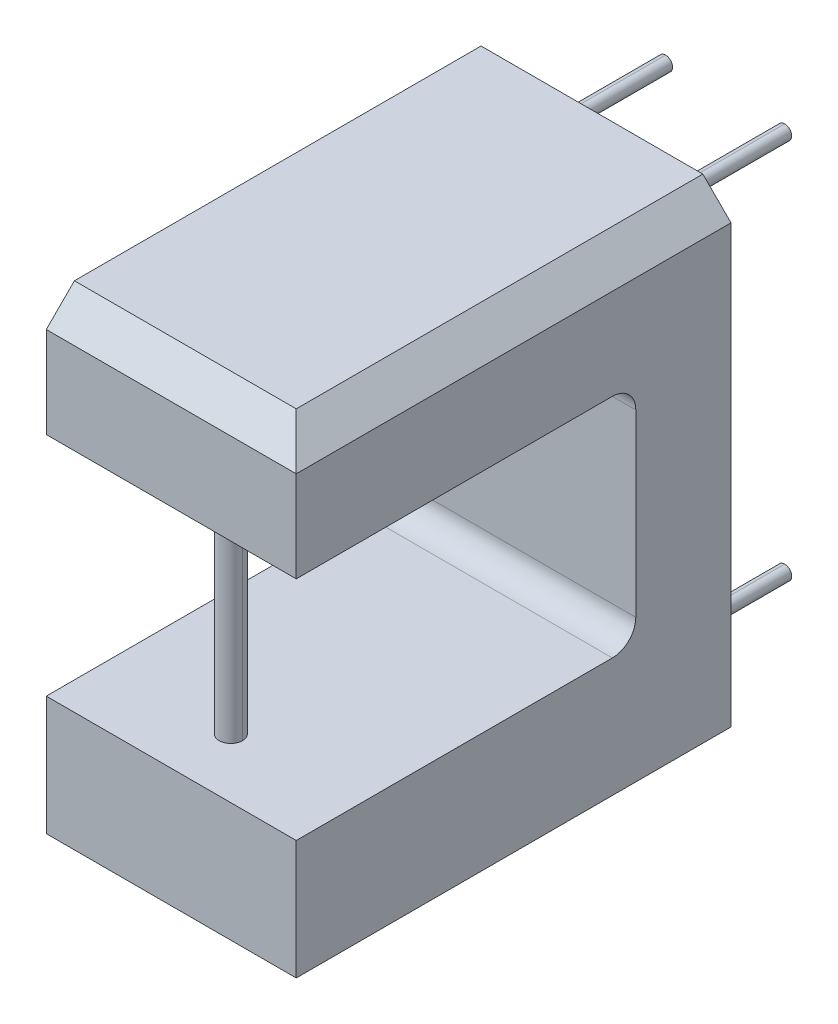
ISO-10303-21;
HEADER;
FILE_DESCRIPTION(('STEP AP214'),'2;1');
FILE_NAME('part.step','',(''),(''),'','','');
FILE_SCHEMA(('AUTOMOTIVE_DESIGN { 1 0 10303 214 1 1 1 1 }'));
ENDSEC;
DATA;
#1=APPLICATION_CONTEXT('core data for automotive mechanical design processes');
#2=APPLICATION_PROTOCOL_DEFINITION('international standard','automotive_design',2000,#1);
#3=PRODUCT_CONTEXT('',#1,'mechanical');
#4=PRODUCT('Part','Part','',(#3));
#5=PRODUCT_RELATED_PRODUCT_CATEGORY('part','',(#4));
#6=PRODUCT_DEFINITION_FORMATION('','',#4);
#7=PRODUCT_DEFINITION_CONTEXT('part definition',#1,'design');
#8=PRODUCT_DEFINITION('design','',#6,#7);
#9=PRODUCT_DEFINITION_SHAPE('','',#8);
#10=(LENGTH_UNIT() NAMED_UNIT(*) SI_UNIT(.MILLI.,.METRE.));
#11=(NAMED_UNIT(*) PLANE_ANGLE_UNIT() SI_UNIT($,.RADIAN.));
#12=(NAMED_UNIT(*) SI_UNIT($,.STERADIAN.) SOLID_ANGLE_UNIT());
#13=UNCERTAINTY_MEASURE_WITH_UNIT(LENGTH_MEASURE(1.E-05),#10,'distance_accuracy_value','');
#14=(GEOMETRIC_REPRESENTATION_CONTEXT(3) GLOBAL_UNCERTAINTY_ASSIGNED_CONTEXT((#13)) GLOBAL_UNIT_ASSIGNED_CONTEXT((#10,
#11,#12)) REPRESENTATION_CONTEXT('',''));
#15=CARTESIAN_POINT('',(0.,0.,0.));
#16=DIRECTION('',(0.,0.,1.));
#17=DIRECTION('',(1.,0.,0.));
#18=AXIS2_PLACEMENT_3D('',#15,#16,#17);
#19=CARTESIAN_POINT('',(-72.,-177.4,53.7));
#20=DIRECTION('',(0.,0.,-1.));
#21=DIRECTION('',(0.,-1.,0.));
#22=AXIS2_PLACEMENT_3D('',#19,#20,#21);
#23=PLANE('',#22);
#24=DIRECTION('',(-1.,0.,0.));
#25=VECTOR('',#24,1.);
#26=CARTESIAN_POINT('',(-72.,-177.4,53.7));
#27=LINE('',#26,#25);
#28=CARTESIAN_POINT('',(-72.6,-177.4,53.7));
#29=VERTEX_POINT('',#28);
#30=CARTESIAN_POINT('',(-77.33,-177.4,53.7));
#31=VERTEX_POINT('',#30);
#32=EDGE_CURVE('E228',#29,#31,#27,.T.);
#33=ORIENTED_EDGE('',*,*,#32,.F.);
#34=DIRECTION('',(0.707106781186539,-0.707106781186556,0.));
#35=VECTOR('',#34,1.);
#36=CARTESIAN_POINT('',(-72.3,-177.7,53.7));
#37=LINE('',#36,#35);
#38=CARTESIAN_POINT('',(-72.,-178.,53.7));
#39=VERTEX_POINT('',#38);
#40=EDGE_CURVE('E385',#29,#39,#37,.T.);
#41=ORIENTED_EDGE('',*,*,#40,.T.);
#42=DIRECTION('',(0.,-1.,0.));
#43=VECTOR('',#42,1.);
#44=CARTESIAN_POINT('',(-72.,-177.4,53.7));
#45=LINE('',#44,#43);
#46=CARTESIAN_POINT('',(-72.,-187.31,53.7));
#47=VERTEX_POINT('',#46);
#48=EDGE_CURVE('E338',#39,#47,#45,.T.);
#49=ORIENTED_EDGE('',*,*,#48,.T.);
#50=DIRECTION('',(-1.,0.,0.));
#51=VECTOR('',#50,1.);
#52=CARTESIAN_POINT('',(-72.,-187.31,53.7));
#53=LINE('',#52,#51);
#54=CARTESIAN_POINT('',(-77.33,-187.31,53.7));
#55=VERTEX_POINT('',#54);
#56=EDGE_CURVE('E253',#47,#55,#53,.T.);
#57=ORIENTED_EDGE('',*,*,#56,.T.);
#58=DIRECTION('',(0.,-1.,0.));
#59=VECTOR('',#58,1.);
#60=CARTESIAN_POINT('',(-77.33,-177.4,53.7));
#61=LINE('',#60,#59);
#62=EDGE_CURVE('E245',#31,#55,#61,.T.);
#63=ORIENTED_EDGE('',*,*,#62,.F.);
#64=EDGE_LOOP('',(#33,#41,#49,#57,#63));
#65=FACE_BOUND('',#64,.T.);
#66=CARTESIAN_POINT('',(-75.935,-178.29,53.7));
#67=DIRECTION('',(0.,0.,-1.));
#68=DIRECTION('',(0.,1.,0.));
#69=AXIS2_PLACEMENT_3D('',#66,#67,#68);
#70=CIRCLE('',#69,0.150000000000011);
#71=CARTESIAN_POINT('',(-75.935,-178.14,53.7));
#72=VERTEX_POINT('',#71);
#73=CARTESIAN_POINT('',(-75.935,-178.44,53.7));
#74=VERTEX_POINT('',#73);
#75=EDGE_CURVE('E287',#72,#74,#70,.T.);
#76=ORIENTED_EDGE('',*,*,#75,.F.);
#77=CARTESIAN_POINT('',(-75.935,-178.29,53.7));
#78=DIRECTION('',(0.,0.,-1.));
#79=DIRECTION('',(0.,-1.,0.));
#80=AXIS2_PLACEMENT_3D('',#77,#78,#79);
#81=CIRCLE('',#80,0.150000000000011);
#82=EDGE_CURVE('E286',#74,#72,#81,.T.);
#83=ORIENTED_EDGE('',*,*,#82,.F.);
#84=EDGE_LOOP('',(#76,#83));
#85=FACE_BOUND('',#84,.T.);
#86=CARTESIAN_POINT('',(-75.935,-186.42,53.7));
#87=DIRECTION('',(0.,0.,-1.));
#88=DIRECTION('',(0.,1.,0.));
#89=AXIS2_PLACEMENT_3D('',#86,#87,#88);
#90=CIRCLE('',#89,0.150000000000011);
#91=CARTESIAN_POINT('',(-75.935,-186.27,53.7));
#92=VERTEX_POINT('',#91);
#93=CARTESIAN_POINT('',(-75.935,-186.57,53.7));
#94=VERTEX_POINT('',#93);
#95=EDGE_CURVE('E445',#92,#94,#90,.T.);
#96=ORIENTED_EDGE('',*,*,#95,.F.);
#97=CARTESIAN_POINT('',(-75.935,-186.42,53.7));
#98=DIRECTION('',(0.,0.,-1.));
#99=DIRECTION('',(0.,-1.,0.));
#100=AXIS2_PLACEMENT_3D('',#97,#98,#99);
#101=CIRCLE('',#100,0.150000000000011);
#102=EDGE_CURVE('E343',#94,#92,#101,.T.);
#103=ORIENTED_EDGE('',*,*,#102,.F.);
#104=EDGE_LOOP('',(#96,#103));
#105=FACE_BOUND('',#104,.T.);
#106=CARTESIAN_POINT('',(-73.395,-178.29,53.7));
#107=DIRECTION('',(0.,0.,-1.));
#108=DIRECTION('',(0.,1.,0.));
#109=AXIS2_PLACEMENT_3D('',#106,#107,#108);
#110=CIRCLE('',#109,0.150000000000011);
#111=CARTESIAN_POINT('',(-73.395,-178.14,53.7));
#112=VERTEX_POINT('',#111);
#113=CARTESIAN_POINT('',(-73.395,-178.44,53.7));
#114=VERTEX_POINT('',#113);
#115=EDGE_CURVE('E303',#112,#114,#110,.T.);
#116=ORIENTED_EDGE('',*,*,#115,.F.);
#117=CARTESIAN_POINT('',(-73.395,-178.29,53.7));
#118=DIRECTION('',(0.,0.,-1.));
#119=DIRECTION('',(0.,-1.,0.));
#120=AXIS2_PLACEMENT_3D('',#117,#118,#119);
#121=CIRCLE('',#120,0.150000000000011);
#122=EDGE_CURVE('E277',#114,#112,#121,.T.);
#123=ORIENTED_EDGE('',*,*,#122,.F.);
#124=EDGE_LOOP('',(#116,#123));
#125=FACE_BOUND('',#124,.T.);
#126=CARTESIAN_POINT('',(-73.395,-186.42,53.7));
#127=DIRECTION('',(0.,0.,-1.));
#128=DIRECTION('',(0.,1.,0.));
#129=AXIS2_PLACEMENT_3D('',#126,#127,#128);
#130=CIRCLE('',#129,0.150000000000011);
#131=CARTESIAN_POINT('',(-73.395,-186.27,53.7));
#132=VERTEX_POINT('',#131);
#133=CARTESIAN_POINT('',(-73.395,-186.57,53.7));
#134=VERTEX_POINT('',#133);
#135=EDGE_CURVE('E292',#132,#134,#130,.T.);
#136=ORIENTED_EDGE('',*,*,#135,.F.);
#137=CARTESIAN_POINT('',(-73.395,-186.42,53.7));
#138=DIRECTION('',(0.,0.,-1.));
#139=DIRECTION('',(0.,-1.,0.));
#140=AXIS2_PLACEMENT_3D('',#137,#138,#139);
#141=CIRCLE('',#140,0.150000000000011);
#142=EDGE_CURVE('E450',#134,#132,#141,.T.);
#143=ORIENTED_EDGE('',*,*,#142,.F.);
#144=EDGE_LOOP('',(#136,#143));
#145=FACE_BOUND('',#144,.T.);
#146=ADVANCED_FACE('F51',(#65,#85,#105,#125,#145),#23,.T.);
#147=CARTESIAN_POINT('',(-72.,-182.355,53.7));
#148=DIRECTION('',(-1.,0.,0.));
#149=DIRECTION('',(0.,0.,1.));
#150=AXIS2_PLACEMENT_3D('',#147,#148,#149);
#151=PLANE('',#150);
#152=ORIENTED_EDGE('',*,*,#48,.F.);
#153=DIRECTION('',(0.,0.,1.));
#154=VECTOR('',#153,1.);
#155=CARTESIAN_POINT('',(-72.,-178.,62.97));
#156=LINE('',#155,#154);
#157=CARTESIAN_POINT('',(-72.,-178.,62.97));
#158=VERTEX_POINT('',#157);
#159=EDGE_CURVE('E388',#39,#158,#156,.T.);
#160=ORIENTED_EDGE('',*,*,#159,.T.);
#161=DIRECTION('',(0.,1.,0.));
#162=VECTOR('',#161,1.);
#163=CARTESIAN_POINT('',(-72.,-179.94,62.97));
#164=LINE('',#163,#162);
#165=CARTESIAN_POINT('',(-72.,-179.94,62.97));
#166=VERTEX_POINT('',#165);
#167=EDGE_CURVE('E239',#166,#158,#164,.T.);
#168=ORIENTED_EDGE('',*,*,#167,.F.);
#169=DIRECTION('',(0.,0.,1.));
#170=VECTOR('',#169,1.);
#171=CARTESIAN_POINT('',(-72.,-179.94,55.73));
#172=LINE('',#171,#170);
#173=CARTESIAN_POINT('',(-72.,-179.94,56.23));
#174=VERTEX_POINT('',#173);
#175=EDGE_CURVE('E364',#174,#166,#172,.T.);
#176=ORIENTED_EDGE('',*,*,#175,.F.);
#177=CARTESIAN_POINT('',(-72.,-180.44,56.23));
#178=DIRECTION('',(-1.,0.,0.));
#179=DIRECTION('',(0.,0.,1.));
#180=AXIS2_PLACEMENT_3D('',#177,#178,#179);
#181=CIRCLE('',#180,0.5);
#182=CARTESIAN_POINT('',(-72.,-180.44,55.73));
#183=VERTEX_POINT('',#182);
#184=EDGE_CURVE('E11',#174,#183,#181,.T.);
#185=ORIENTED_EDGE('',*,*,#184,.T.);
#186=DIRECTION('',(0.,1.,0.));
#187=VECTOR('',#186,1.);
#188=CARTESIAN_POINT('',(-72.,-184.77,55.73));
#189=LINE('',#188,#187);
#190=CARTESIAN_POINT('',(-72.,-184.27,55.73));
#191=VERTEX_POINT('',#190);
#192=EDGE_CURVE('E291',#191,#183,#189,.T.);
#193=ORIENTED_EDGE('',*,*,#192,.F.);
#194=CARTESIAN_POINT('',(-72.,-184.27,56.23));
#195=DIRECTION('',(-1.,0.,0.));
#196=DIRECTION('',(0.,0.,1.));
#197=AXIS2_PLACEMENT_3D('',#194,#195,#196);
#198=CIRCLE('',#197,0.5);
#199=CARTESIAN_POINT('',(-72.,-184.77,56.23));
#200=VERTEX_POINT('',#199);
#201=EDGE_CURVE('E410',#191,#200,#198,.T.);
#202=ORIENTED_EDGE('',*,*,#201,.T.);
#203=DIRECTION('',(0.,0.,-1.));
#204=VECTOR('',#203,1.);
#205=CARTESIAN_POINT('',(-72.,-184.77,62.97));
#206=LINE('',#205,#204);
#207=CARTESIAN_POINT('',(-72.,-184.77,62.97));
#208=VERTEX_POINT('',#207);
#209=EDGE_CURVE('E314',#208,#200,#206,.T.);
#210=ORIENTED_EDGE('',*,*,#209,.F.);
#211=DIRECTION('',(0.,1.,0.));
#212=VECTOR('',#211,1.);
#213=CARTESIAN_POINT('',(-72.,-187.31,62.97));
#214=LINE('',#213,#212);
#215=CARTESIAN_POINT('',(-72.,-187.31,62.97));
#216=VERTEX_POINT('',#215);
#217=EDGE_CURVE('E268',#216,#208,#214,.T.);
#218=ORIENTED_EDGE('',*,*,#217,.F.);
#219=DIRECTION('',(0.,0.,1.));
#220=VECTOR('',#219,1.);
#221=CARTESIAN_POINT('',(-72.,-187.31,53.7));
#222=LINE('',#221,#220);
#223=EDGE_CURVE('E326',#47,#216,#222,.T.);
#224=ORIENTED_EDGE('',*,*,#223,.F.);
#225=EDGE_LOOP('',(#152,#160,#168,#176,#185,#193,#202,#210,#218,#224));
#226=FACE_BOUND('',#225,.T.);
#227=ADVANCED_FACE('F624',(#226),#151,.F.);
#228=CARTESIAN_POINT('',(-75.935,-178.29,53.7));
#229=DIRECTION('',(0.,0.,-1.));
#230=DIRECTION('',(0.,-1.,0.));
#231=AXIS2_PLACEMENT_3D('',#228,#229,#230);
#232=CYLINDRICAL_SURFACE('',#231,0.150000000000011);
#233=DIRECTION('',(0.,0.,-1.));
#234=VECTOR('',#233,1.);
#235=CARTESIAN_POINT('',(-75.935,-178.14,53.7));
#236=LINE('',#235,#234);
#237=CARTESIAN_POINT('',(-75.935,-178.14,51.16));
#238=VERTEX_POINT('',#237);
#239=EDGE_CURVE('E334',#72,#238,#236,.T.);
#240=ORIENTED_EDGE('',*,*,#239,.T.);
#241=CARTESIAN_POINT('',(-75.935,-178.29,51.16));
#242=DIRECTION('',(0.,0.,-1.));
#243=DIRECTION('',(0.,-1.,0.));
#244=AXIS2_PLACEMENT_3D('',#241,#242,#243);
#245=CIRCLE('',#244,0.150000000000011);
#246=CARTESIAN_POINT('',(-75.935,-178.44,51.16));
#247=VERTEX_POINT('',#246);
#248=EDGE_CURVE('E308',#247,#238,#245,.T.);
#249=ORIENTED_EDGE('',*,*,#248,.F.);
#250=DIRECTION('',(0.,0.,-1.));
#251=VECTOR('',#250,1.);
#252=CARTESIAN_POINT('',(-75.935,-178.44,53.7));
#253=LINE('',#252,#251);
#254=EDGE_CURVE('E282',#74,#247,#253,.T.);
#255=ORIENTED_EDGE('',*,*,#254,.F.);
#256=ORIENTED_EDGE('',*,*,#82,.T.);
#257=EDGE_LOOP('',(#240,#249,#255,#256));
#258=FACE_BOUND('',#257,.T.);
#259=ADVANCED_FACE('F656',(#258),#232,.T.);
#260=CARTESIAN_POINT('',(-75.935,-178.29,53.7));
#261=DIRECTION('',(0.,0.,-1.));
#262=DIRECTION('',(0.,-1.,0.));
#263=AXIS2_PLACEMENT_3D('',#260,#261,#262);
#264=CYLINDRICAL_SURFACE('',#263,0.150000000000011);
#265=ORIENTED_EDGE('',*,*,#254,.T.);
#266=CARTESIAN_POINT('',(-75.935,-178.29,51.16));
#267=DIRECTION('',(0.,0.,-1.));
#268=DIRECTION('',(0.,1.,0.));
#269=AXIS2_PLACEMENT_3D('',#266,#267,#268);
#270=CIRCLE('',#269,0.150000000000011);
#271=EDGE_CURVE('E304',#238,#247,#270,.T.);
#272=ORIENTED_EDGE('',*,*,#271,.F.);
#273=ORIENTED_EDGE('',*,*,#239,.F.);
#274=ORIENTED_EDGE('',*,*,#75,.T.);
#275=EDGE_LOOP('',(#265,#272,#273,#274));
#276=FACE_BOUND('',#275,.T.);
#277=ADVANCED_FACE('F660',(#276),#264,.T.);
#278=CARTESIAN_POINT('',(-72.,-179.94,62.97));
#279=DIRECTION('',(0.,0.,1.));
#280=DIRECTION('',(1.,0.,0.));
#281=AXIS2_PLACEMENT_3D('',#278,#279,#280);
#282=PLANE('',#281);
#283=ORIENTED_EDGE('',*,*,#167,.T.);
#284=DIRECTION('',(-1.,0.,0.));
#285=VECTOR('',#284,1.);
#286=CARTESIAN_POINT('',(-72.,-178.,62.97));
#287=LINE('',#286,#285);
#288=CARTESIAN_POINT('',(-77.33,-178.,62.97));
#289=VERTEX_POINT('',#288);
#290=EDGE_CURVE('E354',#158,#289,#287,.T.);
#291=ORIENTED_EDGE('',*,*,#290,.T.);
#292=DIRECTION('',(0.,1.,0.));
#293=VECTOR('',#292,1.);
#294=CARTESIAN_POINT('',(-77.33,-179.94,62.97));
#295=LINE('',#294,#293);
#296=CARTESIAN_POINT('',(-77.33,-179.94,62.97));
#297=VERTEX_POINT('',#296);
#298=EDGE_CURVE('E249',#297,#289,#295,.T.);
#299=ORIENTED_EDGE('',*,*,#298,.F.);
#300=DIRECTION('',(-1.,0.,0.));
#301=VECTOR('',#300,1.);
#302=CARTESIAN_POINT('',(-72.,-179.94,62.97));
#303=LINE('',#302,#301);
#304=EDGE_CURVE('E367',#166,#297,#303,.T.);
#305=ORIENTED_EDGE('',*,*,#304,.F.);
#306=EDGE_LOOP('',(#283,#291,#299,#305));
#307=FACE_BOUND('',#306,.T.);
#308=ADVANCED_FACE('F589',(#307),#282,.T.);
#309=CARTESIAN_POINT('',(-72.,-177.4,62.97));
#310=DIRECTION('',(0.,1.,0.));
#311=DIRECTION('',(1.,0.,0.));
#312=AXIS2_PLACEMENT_3D('',#309,#310,#311);
#313=PLANE('',#312);
#314=DIRECTION('',(0.,0.,-1.));
#315=VECTOR('',#314,1.);
#316=CARTESIAN_POINT('',(-77.33,-177.4,62.97));
#317=LINE('',#316,#315);
#318=CARTESIAN_POINT('',(-77.33,-177.4,62.37));
#319=VERTEX_POINT('',#318);
#320=EDGE_CURVE('E231',#319,#31,#317,.T.);
#321=ORIENTED_EDGE('',*,*,#320,.F.);
#322=DIRECTION('',(1.,0.,0.));
#323=VECTOR('',#322,1.);
#324=CARTESIAN_POINT('',(-72.,-177.4,62.37));
#325=LINE('',#324,#323);
#326=CARTESIAN_POINT('',(-72.6,-177.4,62.37));
#327=VERTEX_POINT('',#326);
#328=EDGE_CURVE('E382',#319,#327,#325,.T.);
#329=ORIENTED_EDGE('',*,*,#328,.T.);
#330=DIRECTION('',(0.,0.,-1.));
#331=VECTOR('',#330,1.);
#332=CARTESIAN_POINT('',(-72.6,-177.4,53.7));
#333=LINE('',#332,#331);
#334=EDGE_CURVE('E234',#327,#29,#333,.T.);
#335=ORIENTED_EDGE('',*,*,#334,.T.);
#336=ORIENTED_EDGE('',*,*,#32,.T.);
#337=EDGE_LOOP('',(#321,#329,#335,#336));
#338=FACE_BOUND('',#337,.T.);
#339=ADVANCED_FACE('F230',(#338),#313,.T.);
#340=CARTESIAN_POINT('',(-72.,-182.355,51.16));
#341=DIRECTION('',(0.,0.,-1.));
#342=DIRECTION('',(0.,-1.,0.));
#343=AXIS2_PLACEMENT_3D('',#340,#341,#342);
#344=PLANE('',#343);
#345=CARTESIAN_POINT('',(-73.395,-186.42,51.16));
#346=DIRECTION('',(0.,0.,-1.));
#347=DIRECTION('',(0.,1.,0.));
#348=AXIS2_PLACEMENT_3D('',#345,#346,#347);
#349=CIRCLE('',#348,0.150000000000011);
#350=CARTESIAN_POINT('',(-73.395,-186.27,51.16));
#351=VERTEX_POINT('',#350);
#352=CARTESIAN_POINT('',(-73.395,-186.57,51.16));
#353=VERTEX_POINT('',#352);
#354=EDGE_CURVE('E240',#351,#353,#349,.T.);
#355=ORIENTED_EDGE('',*,*,#354,.T.);
#356=CARTESIAN_POINT('',(-73.395,-186.42,51.16));
#357=DIRECTION('',(0.,0.,-1.));
#358=DIRECTION('',(0.,-1.,0.));
#359=AXIS2_PLACEMENT_3D('',#356,#357,#358);
#360=CIRCLE('',#359,0.150000000000011);
#361=EDGE_CURVE('E278',#353,#351,#360,.T.);
#362=ORIENTED_EDGE('',*,*,#361,.T.);
#363=EDGE_LOOP('',(#355,#362));
#364=FACE_BOUND('',#363,.T.);
#365=ADVANCED_FACE('F588',(#364),#344,.T.);
#366=CARTESIAN_POINT('',(-73.395,-178.29,53.7));
#367=DIRECTION('',(0.,0.,-1.));
#368=DIRECTION('',(0.,-1.,0.));
#369=AXIS2_PLACEMENT_3D('',#366,#367,#368);
#370=CYLINDRICAL_SURFACE('',#369,0.150000000000011);
#371=DIRECTION('',(0.,0.,-1.));
#372=VECTOR('',#371,1.);
#373=CARTESIAN_POINT('',(-73.395,-178.44,53.7));
#374=LINE('',#373,#372);
#375=CARTESIAN_POINT('',(-73.395,-178.44,51.16));
#376=VERTEX_POINT('',#375);
#377=EDGE_CURVE('E281',#114,#376,#374,.T.);
#378=ORIENTED_EDGE('',*,*,#377,.T.);
#379=CARTESIAN_POINT('',(-73.395,-178.29,51.16));
#380=DIRECTION('',(0.,0.,-1.));
#381=DIRECTION('',(0.,1.,0.));
#382=AXIS2_PLACEMENT_3D('',#379,#380,#381);
#383=CIRCLE('',#382,0.150000000000011);
#384=CARTESIAN_POINT('',(-73.395,-178.14,51.16));
#385=VERTEX_POINT('',#384);
#386=EDGE_CURVE('E266',#385,#376,#383,.T.);
#387=ORIENTED_EDGE('',*,*,#386,.F.);
#388=DIRECTION('',(0.,0.,-1.));
#389=VECTOR('',#388,1.);
#390=CARTESIAN_POINT('',(-73.395,-178.14,53.7));
#391=LINE('',#390,#389);
#392=EDGE_CURVE('E273',#112,#385,#391,.T.);
#393=ORIENTED_EDGE('',*,*,#392,.F.);
#394=ORIENTED_EDGE('',*,*,#115,.T.);
#395=EDGE_LOOP('',(#378,#387,#393,#394));
#396=FACE_BOUND('',#395,.T.);
#397=ADVANCED_FACE('F601',(#396),#370,.T.);
#398=CARTESIAN_POINT('',(-72.,-182.355,51.16));
#399=DIRECTION('',(0.,0.,-1.));
#400=DIRECTION('',(0.,-1.,0.));
#401=AXIS2_PLACEMENT_3D('',#398,#399,#400);
#402=PLANE('',#401);
#403=CARTESIAN_POINT('',(-75.935,-186.42,51.16));
#404=DIRECTION('',(0.,0.,-1.));
#405=DIRECTION('',(0.,1.,0.));
#406=AXIS2_PLACEMENT_3D('',#403,#404,#405);
#407=CIRCLE('',#406,0.150000000000011);
#408=CARTESIAN_POINT('',(-75.935,-186.27,51.16));
#409=VERTEX_POINT('',#408);
#410=CARTESIAN_POINT('',(-75.935,-186.57,51.16));
#411=VERTEX_POINT('',#410);
#412=EDGE_CURVE('E312',#409,#411,#407,.T.);
#413=ORIENTED_EDGE('',*,*,#412,.T.);
#414=CARTESIAN_POINT('',(-75.935,-186.42,51.16));
#415=DIRECTION('',(0.,0.,-1.));
#416=DIRECTION('',(0.,-1.,0.));
#417=AXIS2_PLACEMENT_3D('',#414,#415,#416);
#418=CIRCLE('',#417,0.150000000000011);
#419=EDGE_CURVE('E309',#411,#409,#418,.T.);
#420=ORIENTED_EDGE('',*,*,#419,.T.);
#421=EDGE_LOOP('',(#413,#420));
#422=FACE_BOUND('',#421,.T.);
#423=ADVANCED_FACE('F608',(#422),#402,.T.);
#424=CARTESIAN_POINT('',(-75.935,-186.42,53.7));
#425=DIRECTION('',(0.,0.,-1.));
#426=DIRECTION('',(0.,-1.,0.));
#427=AXIS2_PLACEMENT_3D('',#424,#425,#426);
#428=CYLINDRICAL_SURFACE('',#427,0.150000000000011);
#429=DIRECTION('',(0.,0.,-1.));
#430=VECTOR('',#429,1.);
#431=CARTESIAN_POINT('',(-75.935,-186.57,53.7));
#432=LINE('',#431,#430);
#433=EDGE_CURVE('E313',#94,#411,#432,.T.);
#434=ORIENTED_EDGE('',*,*,#433,.T.);
#435=ORIENTED_EDGE('',*,*,#412,.F.);
#436=DIRECTION('',(0.,0.,-1.));
#437=VECTOR('',#436,1.);
#438=CARTESIAN_POINT('',(-75.935,-186.27,53.7));
#439=LINE('',#438,#437);
#440=EDGE_CURVE('E355',#92,#409,#439,.T.);
#441=ORIENTED_EDGE('',*,*,#440,.F.);
#442=ORIENTED_EDGE('',*,*,#95,.T.);
#443=EDGE_LOOP('',(#434,#435,#441,#442));
#444=FACE_BOUND('',#443,.T.);
#445=ADVANCED_FACE('F612',(#444),#428,.T.);
#446=CARTESIAN_POINT('',(-73.395,-186.42,53.7));
#447=DIRECTION('',(0.,0.,-1.));
#448=DIRECTION('',(0.,-1.,0.));
#449=AXIS2_PLACEMENT_3D('',#446,#447,#448);
#450=CYLINDRICAL_SURFACE('',#449,0.150000000000011);
#451=DIRECTION('',(0.,0.,-1.));
#452=VECTOR('',#451,1.);
#453=CARTESIAN_POINT('',(-73.395,-186.27,53.7));
#454=LINE('',#453,#452);
#455=EDGE_CURVE('E453',#132,#351,#454,.T.);
#456=ORIENTED_EDGE('',*,*,#455,.T.);
#457=ORIENTED_EDGE('',*,*,#361,.F.);
#458=DIRECTION('',(0.,0.,-1.));
#459=VECTOR('',#458,1.);
#460=CARTESIAN_POINT('',(-73.395,-186.57,53.7));
#461=LINE('',#460,#459);
#462=EDGE_CURVE('E295',#134,#353,#461,.T.);
#463=ORIENTED_EDGE('',*,*,#462,.F.);
#464=ORIENTED_EDGE('',*,*,#142,.T.);
#465=EDGE_LOOP('',(#456,#457,#463,#464));
#466=FACE_BOUND('',#465,.T.);
#467=ADVANCED_FACE('F728',(#466),#450,.T.);
#468=CARTESIAN_POINT('',(-77.33,-182.355,53.7));
#469=DIRECTION('',(-1.,0.,0.));
#470=DIRECTION('',(0.,0.,1.));
#471=AXIS2_PLACEMENT_3D('',#468,#469,#470);
#472=PLANE('',#471);
#473=ORIENTED_EDGE('',*,*,#298,.T.);
#474=DIRECTION('',(0.,-0.707106781186556,0.707106781186539));
#475=VECTOR('',#474,1.);
#476=CARTESIAN_POINT('',(-77.33,-175.5425,60.5125000000001));
#477=LINE('',#476,#475);
#478=EDGE_CURVE('E247',#289,#319,#477,.F.);
#479=ORIENTED_EDGE('',*,*,#478,.T.);
#480=ORIENTED_EDGE('',*,*,#320,.T.);
#481=ORIENTED_EDGE('',*,*,#62,.T.);
#482=DIRECTION('',(0.,0.,1.));
#483=VECTOR('',#482,1.);
#484=CARTESIAN_POINT('',(-77.33,-187.31,53.7));
#485=LINE('',#484,#483);
#486=CARTESIAN_POINT('',(-77.33,-187.31,62.97));
#487=VERTEX_POINT('',#486);
#488=EDGE_CURVE('E256',#55,#487,#485,.T.);
#489=ORIENTED_EDGE('',*,*,#488,.T.);
#490=DIRECTION('',(0.,1.,0.));
#491=VECTOR('',#490,1.);
#492=CARTESIAN_POINT('',(-77.33,-187.31,62.97));
#493=LINE('',#492,#491);
#494=CARTESIAN_POINT('',(-77.33,-184.77,62.97));
#495=VERTEX_POINT('',#494);
#496=EDGE_CURVE('E262',#487,#495,#493,.T.);
#497=ORIENTED_EDGE('',*,*,#496,.T.);
#498=DIRECTION('',(0.,0.,-1.));
#499=VECTOR('',#498,1.);
#500=CARTESIAN_POINT('',(-77.33,-184.77,62.97));
#501=LINE('',#500,#499);
#502=CARTESIAN_POINT('',(-77.33,-184.77,56.23));
#503=VERTEX_POINT('',#502);
#504=EDGE_CURVE('E333',#495,#503,#501,.T.);
#505=ORIENTED_EDGE('',*,*,#504,.T.);
#506=CARTESIAN_POINT('',(-77.33,-184.27,56.23));
#507=DIRECTION('',(-1.,0.,0.));
#508=DIRECTION('',(0.,0.,1.));
#509=AXIS2_PLACEMENT_3D('',#506,#507,#508);
#510=CIRCLE('',#509,0.5);
#511=CARTESIAN_POINT('',(-77.33,-184.27,55.73));
#512=VERTEX_POINT('',#511);
#513=EDGE_CURVE('E407',#503,#512,#510,.F.);
#514=ORIENTED_EDGE('',*,*,#513,.T.);
#515=DIRECTION('',(0.,1.,0.));
#516=VECTOR('',#515,1.);
#517=CARTESIAN_POINT('',(-77.33,-184.77,55.73));
#518=LINE('',#517,#516);
#519=CARTESIAN_POINT('',(-77.33,-180.44,55.73));
#520=VERTEX_POINT('',#519);
#521=EDGE_CURVE('E321',#512,#520,#518,.T.);
#522=ORIENTED_EDGE('',*,*,#521,.T.);
#523=CARTESIAN_POINT('',(-77.33,-180.44,56.23));
#524=DIRECTION('',(-1.,0.,0.));
#525=DIRECTION('',(0.,0.,1.));
#526=AXIS2_PLACEMENT_3D('',#523,#524,#525);
#527=CIRCLE('',#526,0.5);
#528=CARTESIAN_POINT('',(-77.33,-179.94,56.23));
#529=VERTEX_POINT('',#528);
#530=EDGE_CURVE('E60',#520,#529,#527,.F.);
#531=ORIENTED_EDGE('',*,*,#530,.T.);
#532=DIRECTION('',(0.,0.,1.));
#533=VECTOR('',#532,1.);
#534=CARTESIAN_POINT('',(-77.33,-179.94,55.73));
#535=LINE('',#534,#533);
#536=EDGE_CURVE('E319',#529,#297,#535,.T.);
#537=ORIENTED_EDGE('',*,*,#536,.T.);
#538=EDGE_LOOP('',(#473,#479,#480,#481,#489,#497,#505,#514,#522,#531,#537));
#539=FACE_BOUND('',#538,.T.);
#540=ADVANCED_FACE('F243',(#539),#472,.T.);
#541=CARTESIAN_POINT('',(-73.395,-186.42,53.7));
#542=DIRECTION('',(0.,0.,-1.));
#543=DIRECTION('',(0.,-1.,0.));
#544=AXIS2_PLACEMENT_3D('',#541,#542,#543);
#545=CYLINDRICAL_SURFACE('',#544,0.150000000000011);
#546=ORIENTED_EDGE('',*,*,#462,.T.);
#547=ORIENTED_EDGE('',*,*,#354,.F.);
#548=ORIENTED_EDGE('',*,*,#455,.F.);
#549=ORIENTED_EDGE('',*,*,#135,.T.);
#550=EDGE_LOOP('',(#546,#547,#548,#549));
#551=FACE_BOUND('',#550,.T.);
#552=ADVANCED_FACE('F716',(#551),#545,.T.);
#553=CARTESIAN_POINT('',(-72.,-187.31,53.7));
#554=DIRECTION('',(0.,-1.,0.));
#555=DIRECTION('',(0.,0.,-1.));
#556=AXIS2_PLACEMENT_3D('',#553,#554,#555);
#557=PLANE('',#556);
#558=DIRECTION('',(-1.,0.,0.));
#559=VECTOR('',#558,1.);
#560=CARTESIAN_POINT('',(-72.,-187.31,62.97));
#561=LINE('',#560,#559);
#562=EDGE_CURVE('E296',#216,#487,#561,.T.);
#563=ORIENTED_EDGE('',*,*,#562,.T.);
#564=ORIENTED_EDGE('',*,*,#488,.F.);
#565=ORIENTED_EDGE('',*,*,#56,.F.);
#566=ORIENTED_EDGE('',*,*,#223,.T.);
#567=EDGE_LOOP('',(#563,#564,#565,#566));
#568=FACE_BOUND('',#567,.T.);
#569=ADVANCED_FACE('F647',(#568),#557,.T.);
#570=CARTESIAN_POINT('',(-72.,-184.77,55.73));
#571=DIRECTION('',(0.,0.,1.));
#572=DIRECTION('',(1.,0.,0.));
#573=AXIS2_PLACEMENT_3D('',#570,#571,#572);
#574=PLANE('',#573);
#575=ORIENTED_EDGE('',*,*,#521,.F.);
#576=DIRECTION('',(-1.,0.,0.));
#577=VECTOR('',#576,1.);
#578=CARTESIAN_POINT('',(-72.,-184.27,55.73));
#579=LINE('',#578,#577);
#580=EDGE_CURVE('E402',#512,#191,#579,.F.);
#581=ORIENTED_EDGE('',*,*,#580,.T.);
#582=ORIENTED_EDGE('',*,*,#192,.T.);
#583=DIRECTION('',(-1.,0.,0.));
#584=VECTOR('',#583,1.);
#585=CARTESIAN_POINT('',(-77.33,-180.44,55.73));
#586=LINE('',#585,#584);
#587=EDGE_CURVE('E398',#183,#520,#586,.T.);
#588=ORIENTED_EDGE('',*,*,#587,.T.);
#589=EDGE_LOOP('',(#575,#581,#582,#588));
#590=FACE_BOUND('',#589,.T.);
#591=ADVANCED_FACE('F641',(#590),#574,.T.);
#592=CARTESIAN_POINT('',(-72.,-187.31,62.97));
#593=DIRECTION('',(0.,0.,1.));
#594=DIRECTION('',(1.,0.,0.));
#595=AXIS2_PLACEMENT_3D('',#592,#593,#594);
#596=PLANE('',#595);
#597=DIRECTION('',(-1.,0.,0.));
#598=VECTOR('',#597,1.);
#599=CARTESIAN_POINT('',(-72.,-184.77,62.97));
#600=LINE('',#599,#598);
#601=EDGE_CURVE('E272',#208,#495,#600,.T.);
#602=ORIENTED_EDGE('',*,*,#601,.T.);
#603=ORIENTED_EDGE('',*,*,#496,.F.);
#604=ORIENTED_EDGE('',*,*,#562,.F.);
#605=ORIENTED_EDGE('',*,*,#217,.T.);
#606=EDGE_LOOP('',(#602,#603,#604,#605));
#607=FACE_BOUND('',#606,.T.);
#608=ADVANCED_FACE('F646',(#607),#596,.T.);
#609=CARTESIAN_POINT('',(-72.,-182.355,51.16));
#610=DIRECTION('',(0.,0.,-1.));
#611=DIRECTION('',(0.,-1.,0.));
#612=AXIS2_PLACEMENT_3D('',#609,#610,#611);
#613=PLANE('',#612);
#614=ORIENTED_EDGE('',*,*,#386,.T.);
#615=CARTESIAN_POINT('',(-73.395,-178.29,51.16));
#616=DIRECTION('',(0.,0.,-1.));
#617=DIRECTION('',(0.,-1.,0.));
#618=AXIS2_PLACEMENT_3D('',#615,#616,#617);
#619=CIRCLE('',#618,0.150000000000011);
#620=EDGE_CURVE('E276',#376,#385,#619,.T.);
#621=ORIENTED_EDGE('',*,*,#620,.T.);
#622=EDGE_LOOP('',(#614,#621));
#623=FACE_BOUND('',#622,.T.);
#624=ADVANCED_FACE('F667',(#623),#613,.T.);
#625=CARTESIAN_POINT('',(-73.395,-178.29,53.7));
#626=DIRECTION('',(0.,0.,-1.));
#627=DIRECTION('',(0.,-1.,0.));
#628=AXIS2_PLACEMENT_3D('',#625,#626,#627);
#629=CYLINDRICAL_SURFACE('',#628,0.150000000000011);
#630=ORIENTED_EDGE('',*,*,#392,.T.);
#631=ORIENTED_EDGE('',*,*,#620,.F.);
#632=ORIENTED_EDGE('',*,*,#377,.F.);
#633=ORIENTED_EDGE('',*,*,#122,.T.);
#634=EDGE_LOOP('',(#630,#631,#632,#633));
#635=FACE_BOUND('',#634,.T.);
#636=ADVANCED_FACE('F671',(#635),#629,.T.);
#637=CARTESIAN_POINT('',(-72.,-182.355,51.16));
#638=DIRECTION('',(0.,0.,-1.));
#639=DIRECTION('',(0.,-1.,0.));
#640=AXIS2_PLACEMENT_3D('',#637,#638,#639);
#641=PLANE('',#640);
#642=ORIENTED_EDGE('',*,*,#271,.T.);
#643=ORIENTED_EDGE('',*,*,#248,.T.);
#644=EDGE_LOOP('',(#642,#643));
#645=FACE_BOUND('',#644,.T.);
#646=ADVANCED_FACE('F679',(#645),#641,.T.);
#647=CARTESIAN_POINT('',(-72.,-184.77,62.97));
#648=DIRECTION('',(0.,1.,0.));
#649=DIRECTION('',(1.,0.,0.));
#650=AXIS2_PLACEMENT_3D('',#647,#648,#649);
#651=PLANE('',#650);
#652=ORIENTED_EDGE('',*,*,#209,.T.);
#653=DIRECTION('',(-1.,0.,0.));
#654=VECTOR('',#653,1.);
#655=CARTESIAN_POINT('',(-77.33,-184.77,56.23));
#656=LINE('',#655,#654);
#657=EDGE_CURVE('E391',#200,#503,#656,.T.);
#658=ORIENTED_EDGE('',*,*,#657,.T.);
#659=ORIENTED_EDGE('',*,*,#504,.F.);
#660=ORIENTED_EDGE('',*,*,#601,.F.);
#661=EDGE_LOOP('',(#652,#658,#659,#660));
#662=FACE_BOUND('',#661,.T.);
#663=CARTESIAN_POINT('',(-74.665,-184.77,61.7));
#664=DIRECTION('',(0.,-1.,0.));
#665=DIRECTION('',(-1.,0.,0.));
#666=AXIS2_PLACEMENT_3D('',#663,#664,#665);
#667=CIRCLE('',#666,0.25);
#668=CARTESIAN_POINT('',(-74.915,-184.77,61.7));
#669=VERTEX_POINT('',#668);
#670=CARTESIAN_POINT('',(-74.415,-184.77,61.7));
#671=VERTEX_POINT('',#670);
#672=EDGE_CURVE('E318',#669,#671,#667,.T.);
#673=ORIENTED_EDGE('',*,*,#672,.T.);
#674=CARTESIAN_POINT('',(-74.665,-184.77,61.7));
#675=DIRECTION('',(0.,-1.,0.));
#676=DIRECTION('',(1.,0.,0.));
#677=AXIS2_PLACEMENT_3D('',#674,#675,#676);
#678=CIRCLE('',#677,0.25);
#679=EDGE_CURVE('E347',#671,#669,#678,.T.);
#680=ORIENTED_EDGE('',*,*,#679,.T.);
#681=EDGE_LOOP('',(#673,#680));
#682=FACE_BOUND('',#681,.T.);
#683=ADVANCED_FACE('F683',(#662,#682),#651,.T.);
#684=CARTESIAN_POINT('',(-75.935,-186.42,53.7));
#685=DIRECTION('',(0.,0.,-1.));
#686=DIRECTION('',(0.,-1.,0.));
#687=AXIS2_PLACEMENT_3D('',#684,#685,#686);
#688=CYLINDRICAL_SURFACE('',#687,0.150000000000011);
#689=ORIENTED_EDGE('',*,*,#440,.T.);
#690=ORIENTED_EDGE('',*,*,#419,.F.);
#691=ORIENTED_EDGE('',*,*,#433,.F.);
#692=ORIENTED_EDGE('',*,*,#102,.T.);
#693=EDGE_LOOP('',(#689,#690,#691,#692));
#694=FACE_BOUND('',#693,.T.);
#695=ADVANCED_FACE('F691',(#694),#688,.T.);
#696=CARTESIAN_POINT('',(-74.665,-179.94,61.7));
#697=DIRECTION('',(0.,-1.,0.));
#698=DIRECTION('',(1.,0.,0.));
#699=AXIS2_PLACEMENT_3D('',#696,#697,#698);
#700=CYLINDRICAL_SURFACE('',#699,0.25);
#701=DIRECTION('',(0.,-1.,0.));
#702=VECTOR('',#701,1.);
#703=CARTESIAN_POINT('',(-74.415,-179.94,61.7));
#704=LINE('',#703,#702);
#705=CARTESIAN_POINT('',(-74.415,-179.94,61.7));
#706=VERTEX_POINT('',#705);
#707=EDGE_CURVE('E427',#706,#671,#704,.T.);
#708=ORIENTED_EDGE('',*,*,#707,.F.);
#709=CARTESIAN_POINT('',(-74.665,-179.94,61.7));
#710=DIRECTION('',(0.,-1.,0.));
#711=DIRECTION('',(1.,0.,0.));
#712=AXIS2_PLACEMENT_3D('',#709,#710,#711);
#713=CIRCLE('',#712,0.25);
#714=CARTESIAN_POINT('',(-74.915,-179.94,61.7));
#715=VERTEX_POINT('',#714);
#716=EDGE_CURVE('E339',#706,#715,#713,.T.);
#717=ORIENTED_EDGE('',*,*,#716,.T.);
#718=DIRECTION('',(0.,-1.,0.));
#719=VECTOR('',#718,1.);
#720=CARTESIAN_POINT('',(-74.915,-179.94,61.7));
#721=LINE('',#720,#719);
#722=EDGE_CURVE('E344',#715,#669,#721,.T.);
#723=ORIENTED_EDGE('',*,*,#722,.T.);
#724=ORIENTED_EDGE('',*,*,#679,.F.);
#725=EDGE_LOOP('',(#708,#717,#723,#724));
#726=FACE_BOUND('',#725,.T.);
#727=ADVANCED_FACE('F695',(#726),#700,.T.);
#728=CARTESIAN_POINT('',(-74.665,-179.94,61.7));
#729=DIRECTION('',(0.,-1.,0.));
#730=DIRECTION('',(1.,0.,0.));
#731=AXIS2_PLACEMENT_3D('',#728,#729,#730);
#732=CYLINDRICAL_SURFACE('',#731,0.25);
#733=ORIENTED_EDGE('',*,*,#722,.F.);
#734=CARTESIAN_POINT('',(-74.665,-179.94,61.7));
#735=DIRECTION('',(0.,-1.,0.));
#736=DIRECTION('',(-1.,0.,0.));
#737=AXIS2_PLACEMENT_3D('',#734,#735,#736);
#738=CIRCLE('',#737,0.25);
#739=EDGE_CURVE('E431',#715,#706,#738,.T.);
#740=ORIENTED_EDGE('',*,*,#739,.T.);
#741=ORIENTED_EDGE('',*,*,#707,.T.);
#742=ORIENTED_EDGE('',*,*,#672,.F.);
#743=EDGE_LOOP('',(#733,#740,#741,#742));
#744=FACE_BOUND('',#743,.T.);
#745=ADVANCED_FACE('F748',(#744),#732,.T.);
#746=CARTESIAN_POINT('',(-72.,-179.94,55.73));
#747=DIRECTION('',(0.,-1.,0.));
#748=DIRECTION('',(0.,0.,-1.));
#749=AXIS2_PLACEMENT_3D('',#746,#747,#748);
#750=PLANE('',#749);
#751=ORIENTED_EDGE('',*,*,#536,.F.);
#752=DIRECTION('',(-1.,0.,0.));
#753=VECTOR('',#752,1.);
#754=CARTESIAN_POINT('',(-72.,-179.94,56.23));
#755=LINE('',#754,#753);
#756=EDGE_CURVE('E67',#529,#174,#755,.F.);
#757=ORIENTED_EDGE('',*,*,#756,.T.);
#758=ORIENTED_EDGE('',*,*,#175,.T.);
#759=ORIENTED_EDGE('',*,*,#304,.T.);
#760=EDGE_LOOP('',(#751,#757,#758,#759));
#761=FACE_BOUND('',#760,.T.);
#762=ORIENTED_EDGE('',*,*,#739,.F.);
#763=ORIENTED_EDGE('',*,*,#716,.F.);
#764=EDGE_LOOP('',(#762,#763));
#765=FACE_BOUND('',#764,.T.);
#766=ADVANCED_FACE('F767',(#761,#765),#750,.T.);
#767=CARTESIAN_POINT('',(-72.6,-177.4,62.97));
#768=DIRECTION('',(0.707106781186556,0.707106781186539,0.));
#769=DIRECTION('',(0.,0.,1.));
#770=AXIS2_PLACEMENT_3D('',#767,#768,#769);
#771=PLANE('',#770);
#772=ORIENTED_EDGE('',*,*,#40,.F.);
#773=ORIENTED_EDGE('',*,*,#334,.F.);
#774=DIRECTION('',(-0.577350269189621,0.577350269189635,-0.577350269189621));
#775=VECTOR('',#774,1.);
#776=CARTESIAN_POINT('',(-72.4,-177.6,62.57));
#777=LINE('',#776,#775);
#778=EDGE_CURVE('E368',#158,#327,#777,.T.);
#779=ORIENTED_EDGE('',*,*,#778,.F.);
#780=ORIENTED_EDGE('',*,*,#159,.F.);
#781=EDGE_LOOP('',(#772,#773,#779,#780));
#782=FACE_BOUND('',#781,.T.);
#783=ADVANCED_FACE('F772',(#782),#771,.T.);
#784=CARTESIAN_POINT('',(-72.,-178.,62.97));
#785=DIRECTION('',(0.,-0.707106781186539,-0.707106781186556));
#786=DIRECTION('',(-1.,0.,0.));
#787=AXIS2_PLACEMENT_3D('',#784,#785,#786);
#788=PLANE('',#787);
#789=ORIENTED_EDGE('',*,*,#778,.T.);
#790=ORIENTED_EDGE('',*,*,#328,.F.);
#791=ORIENTED_EDGE('',*,*,#478,.F.);
#792=ORIENTED_EDGE('',*,*,#290,.F.);
#793=EDGE_LOOP('',(#789,#790,#791,#792));
#794=FACE_BOUND('',#793,.T.);
#795=ADVANCED_FACE('F867',(#794),#788,.F.);
#796=CARTESIAN_POINT('',(-72.,-184.27,56.23));
#797=DIRECTION('',(1.,0.,0.));
#798=DIRECTION('',(0.,0.,-1.));
#799=AXIS2_PLACEMENT_3D('',#796,#797,#798);
#800=CYLINDRICAL_SURFACE('',#799,0.5);
#801=ORIENTED_EDGE('',*,*,#201,.F.);
#802=ORIENTED_EDGE('',*,*,#580,.F.);
#803=ORIENTED_EDGE('',*,*,#513,.F.);
#804=ORIENTED_EDGE('',*,*,#657,.F.);
#805=EDGE_LOOP('',(#801,#802,#803,#804));
#806=FACE_BOUND('',#805,.T.);
#807=ADVANCED_FACE('F877',(#806),#800,.F.);
#808=CARTESIAN_POINT('',(-72.,-180.44,56.23));
#809=DIRECTION('',(1.,0.,0.));
#810=DIRECTION('',(0.,0.,-1.));
#811=AXIS2_PLACEMENT_3D('',#808,#809,#810);
#812=CYLINDRICAL_SURFACE('',#811,0.5);
#813=ORIENTED_EDGE('',*,*,#184,.F.);
#814=ORIENTED_EDGE('',*,*,#756,.F.);
#815=ORIENTED_EDGE('',*,*,#530,.F.);
#816=ORIENTED_EDGE('',*,*,#587,.F.);
#817=EDGE_LOOP('',(#813,#814,#815,#816));
#818=FACE_BOUND('',#817,.T.);
#819=ADVANCED_FACE('F53',(#818),#812,.F.);
#820=CLOSED_SHELL('',(#146,#227,#259,#277,#308,#339,#365,#397,#423,#445,#467,#540,#552,#569,
#591,#608,#624,#636,#646,#683,#695,#727,#745,#766,#783,#795,#807,#819));
#821=MANIFOLD_SOLID_BREP('B2',#820);
#822=ADVANCED_BREP_SHAPE_REPRESENTATION('',(#18,#821),#14);
#823=SHAPE_DEFINITION_REPRESENTATION(#9,#822);
ENDSEC;
END-ISO-10303-21;
